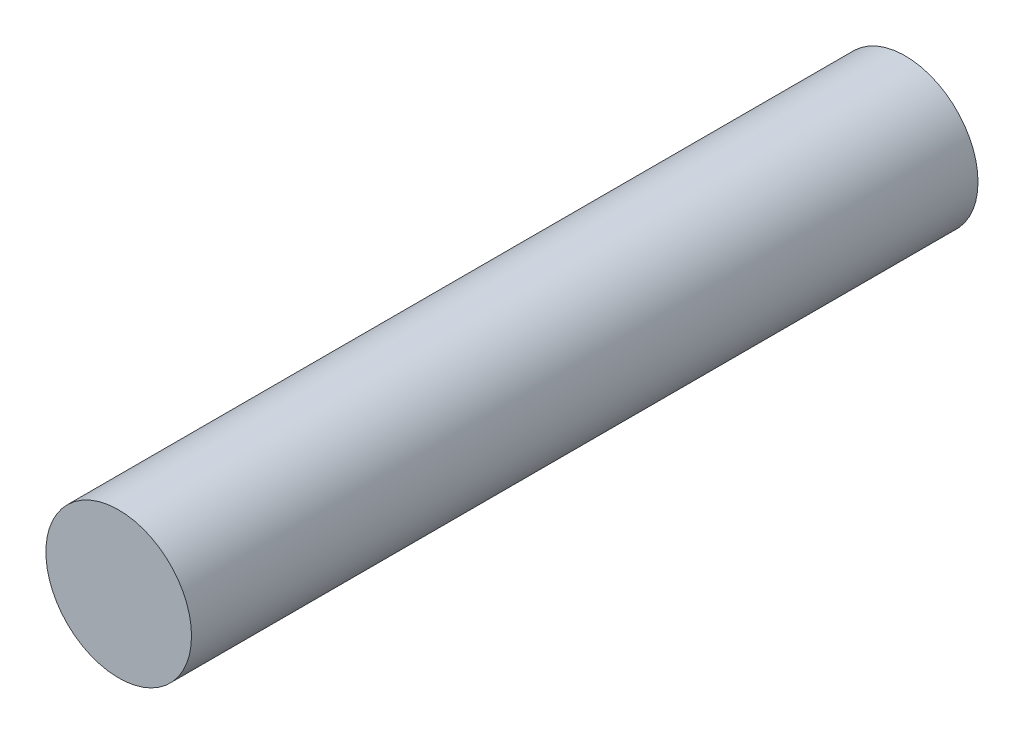
ISO-10303-21;
HEADER;
FILE_DESCRIPTION(('STEP AP214'),'2;1');
FILE_NAME('part.step','',(''),(''),'','','');
FILE_SCHEMA(('AUTOMOTIVE_DESIGN { 1 0 10303 214 1 1 1 1 }'));
ENDSEC;
DATA;
#1=APPLICATION_CONTEXT('core data for automotive mechanical design processes');
#2=APPLICATION_PROTOCOL_DEFINITION('international standard','automotive_design',2000,#1);
#3=PRODUCT_CONTEXT('',#1,'mechanical');
#4=PRODUCT('Part','Part','',(#3));
#5=PRODUCT_RELATED_PRODUCT_CATEGORY('part','',(#4));
#6=PRODUCT_DEFINITION_FORMATION('','',#4);
#7=PRODUCT_DEFINITION_CONTEXT('part definition',#1,'design');
#8=PRODUCT_DEFINITION('design','',#6,#7);
#9=PRODUCT_DEFINITION_SHAPE('','',#8);
#10=(LENGTH_UNIT() NAMED_UNIT(*) SI_UNIT(.MILLI.,.METRE.));
#11=(NAMED_UNIT(*) PLANE_ANGLE_UNIT() SI_UNIT($,.RADIAN.));
#12=(NAMED_UNIT(*) SI_UNIT($,.STERADIAN.) SOLID_ANGLE_UNIT());
#13=UNCERTAINTY_MEASURE_WITH_UNIT(LENGTH_MEASURE(1.E-05),#10,'distance_accuracy_value','');
#14=(GEOMETRIC_REPRESENTATION_CONTEXT(3) GLOBAL_UNCERTAINTY_ASSIGNED_CONTEXT((#13)) GLOBAL_UNIT_ASSIGNED_CONTEXT((#10,
#11,#12)) REPRESENTATION_CONTEXT('',''));
#15=CARTESIAN_POINT('',(0.,0.,0.));
#16=DIRECTION('',(0.,0.,1.));
#17=DIRECTION('',(1.,0.,0.));
#18=AXIS2_PLACEMENT_3D('',#15,#16,#17);
#19=CARTESIAN_POINT('',(0.,0.,27.));
#20=DIRECTION('',(0.,0.,-1.));
#21=DIRECTION('',(-1.,0.,0.));
#22=AXIS2_PLACEMENT_3D('',#19,#20,#21);
#23=CYLINDRICAL_SURFACE('',#22,2.5);
#24=CARTESIAN_POINT('',(0.,0.,27.));
#25=DIRECTION('',(0.,0.,1.));
#26=DIRECTION('',(1.,0.,0.));
#27=AXIS2_PLACEMENT_3D('',#24,#25,#26);
#28=CIRCLE('',#27,2.5);
#29=CARTESIAN_POINT('',(2.5,0.,27.));
#30=VERTEX_POINT('',#29);
#31=EDGE_CURVE('E10',#30,#30,#28,.T.);
#32=ORIENTED_EDGE('',*,*,#31,.F.);
#33=EDGE_LOOP('',(#32));
#34=FACE_BOUND('',#33,.T.);
#35=CARTESIAN_POINT('',(0.,0.,0.));
#36=DIRECTION('',(0.,0.,1.));
#37=DIRECTION('',(1.,0.,0.));
#38=AXIS2_PLACEMENT_3D('',#35,#36,#37);
#39=CIRCLE('',#38,2.5);
#40=CARTESIAN_POINT('',(2.5,0.,0.));
#41=VERTEX_POINT('',#40);
#42=EDGE_CURVE('E34',#41,#41,#39,.T.);
#43=ORIENTED_EDGE('',*,*,#42,.T.);
#44=EDGE_LOOP('',(#43));
#45=FACE_BOUND('',#44,.T.);
#46=ADVANCED_FACE('F31',(#34,#45),#23,.T.);
#47=CARTESIAN_POINT('',(0.,0.,27.));
#48=DIRECTION('',(0.,0.,1.));
#49=DIRECTION('',(1.,0.,0.));
#50=AXIS2_PLACEMENT_3D('',#47,#48,#49);
#51=PLANE('',#50);
#52=ORIENTED_EDGE('',*,*,#31,.T.);
#53=EDGE_LOOP('',(#52));
#54=FACE_BOUND('',#53,.T.);
#55=ADVANCED_FACE('F46',(#54),#51,.T.);
#56=CARTESIAN_POINT('',(0.,0.,0.));
#57=DIRECTION('',(0.,0.,1.));
#58=DIRECTION('',(1.,0.,0.));
#59=AXIS2_PLACEMENT_3D('',#56,#57,#58);
#60=PLANE('',#59);
#61=ORIENTED_EDGE('',*,*,#42,.F.);
#62=EDGE_LOOP('',(#61));
#63=FACE_BOUND('',#62,.T.);
#64=ADVANCED_FACE('F44',(#63),#60,.F.);
#65=CLOSED_SHELL('',(#46,#55,#64));
#66=MANIFOLD_SOLID_BREP('B2',#65);
#67=ADVANCED_BREP_SHAPE_REPRESENTATION('',(#18,#66),#14);
#68=SHAPE_DEFINITION_REPRESENTATION(#9,#67);
ENDSEC;
END-ISO-10303-21;
